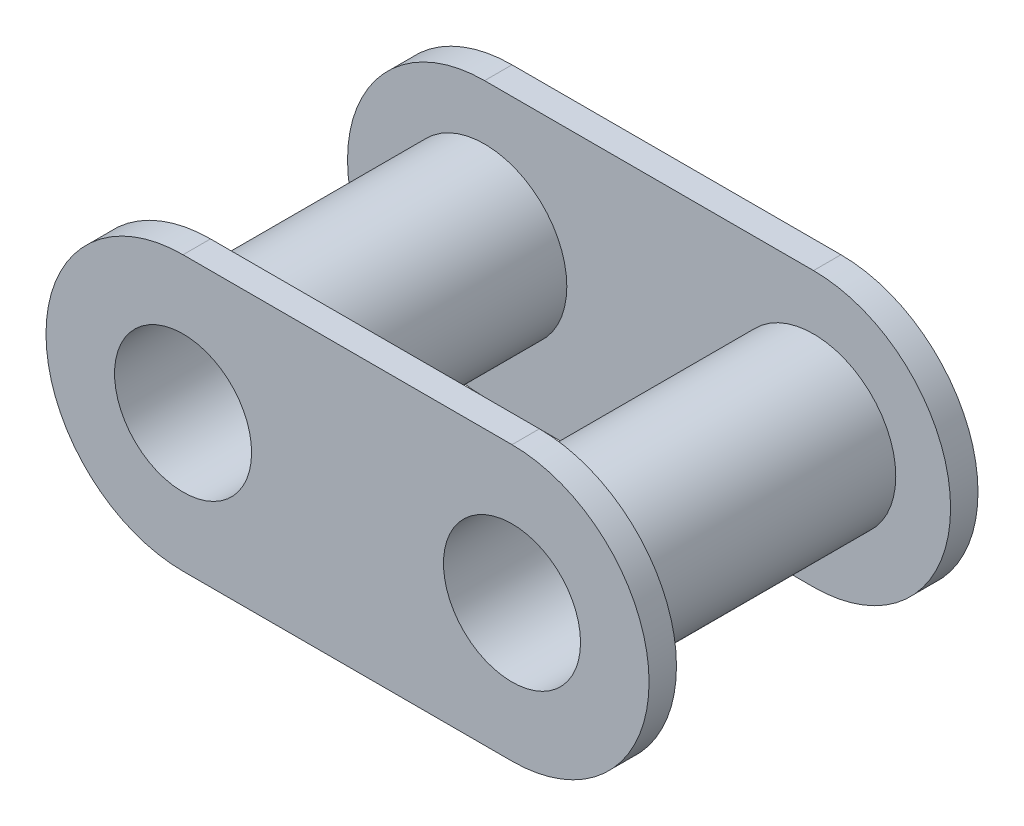
ISO-10303-21;
HEADER;
FILE_DESCRIPTION(('STEP AP214'),'2;1');
FILE_NAME('part.step','',(''),(''),'','','');
FILE_SCHEMA(('AUTOMOTIVE_DESIGN { 1 0 10303 214 1 1 1 1 }'));
ENDSEC;
DATA;
#1=APPLICATION_CONTEXT('core data for automotive mechanical design processes');
#2=APPLICATION_PROTOCOL_DEFINITION('international standard','automotive_design',2000,#1);
#3=PRODUCT_CONTEXT('',#1,'mechanical');
#4=PRODUCT('Part','Part','',(#3));
#5=PRODUCT_RELATED_PRODUCT_CATEGORY('part','',(#4));
#6=PRODUCT_DEFINITION_FORMATION('','',#4);
#7=PRODUCT_DEFINITION_CONTEXT('part definition',#1,'design');
#8=PRODUCT_DEFINITION('design','',#6,#7);
#9=PRODUCT_DEFINITION_SHAPE('','',#8);
#10=(LENGTH_UNIT() NAMED_UNIT(*) SI_UNIT(.MILLI.,.METRE.));
#11=(NAMED_UNIT(*) PLANE_ANGLE_UNIT() SI_UNIT($,.RADIAN.));
#12=(NAMED_UNIT(*) SI_UNIT($,.STERADIAN.) SOLID_ANGLE_UNIT());
#13=UNCERTAINTY_MEASURE_WITH_UNIT(LENGTH_MEASURE(1.E-05),#10,'distance_accuracy_value','');
#14=(GEOMETRIC_REPRESENTATION_CONTEXT(3) GLOBAL_UNCERTAINTY_ASSIGNED_CONTEXT((#13)) GLOBAL_UNIT_ASSIGNED_CONTEXT((#10,
#11,#12)) REPRESENTATION_CONTEXT('',''));
#15=CARTESIAN_POINT('',(0.,0.,0.));
#16=DIRECTION('',(0.,0.,1.));
#17=DIRECTION('',(1.,0.,0.));
#18=AXIS2_PLACEMENT_3D('',#15,#16,#17);
#19=CARTESIAN_POINT('',(-3.,0.,0.5));
#20=DIRECTION('',(0.,0.,1.));
#21=DIRECTION('',(1.,0.,0.));
#22=AXIS2_PLACEMENT_3D('',#19,#20,#21);
#23=PLANE('',#22);
#24=CARTESIAN_POINT('',(-3.,0.,0.5));
#25=DIRECTION('',(0.,0.,1.));
#26=DIRECTION('',(1.,0.,0.));
#27=AXIS2_PLACEMENT_3D('',#24,#25,#26);
#28=CIRCLE('',#27,1.5);
#29=CARTESIAN_POINT('',(-1.5,0.,0.5));
#30=VERTEX_POINT('',#29);
#31=EDGE_CURVE('E189',#30,#30,#28,.T.);
#32=ORIENTED_EDGE('',*,*,#31,.F.);
#33=EDGE_LOOP('',(#32));
#34=FACE_BOUND('',#33,.T.);
#35=CARTESIAN_POINT('',(-3.,0.,0.5));
#36=DIRECTION('',(0.,0.,1.));
#37=DIRECTION('',(1.,0.,0.));
#38=AXIS2_PLACEMENT_3D('',#35,#36,#37);
#39=CIRCLE('',#38,2.5);
#40=CARTESIAN_POINT('',(-3.,2.5,0.5));
#41=VERTEX_POINT('',#40);
#42=CARTESIAN_POINT('',(-3.,-2.5,0.5));
#43=VERTEX_POINT('',#42);
#44=EDGE_CURVE('E202',#41,#43,#39,.T.);
#45=ORIENTED_EDGE('',*,*,#44,.T.);
#46=DIRECTION('',(1.,0.,0.));
#47=VECTOR('',#46,1.);
#48=CARTESIAN_POINT('',(-3.,-2.5,0.5));
#49=LINE('',#48,#47);
#50=CARTESIAN_POINT('',(3.,-2.5,0.5));
#51=VERTEX_POINT('',#50);
#52=EDGE_CURVE('E100',#43,#51,#49,.T.);
#53=ORIENTED_EDGE('',*,*,#52,.T.);
#54=CARTESIAN_POINT('',(3.,0.,0.5));
#55=DIRECTION('',(0.,0.,1.));
#56=DIRECTION('',(1.,0.,0.));
#57=AXIS2_PLACEMENT_3D('',#54,#55,#56);
#58=CIRCLE('',#57,2.5);
#59=CARTESIAN_POINT('',(3.,2.5,0.5));
#60=VERTEX_POINT('',#59);
#61=EDGE_CURVE('E207',#51,#60,#58,.T.);
#62=ORIENTED_EDGE('',*,*,#61,.T.);
#63=DIRECTION('',(-1.,0.,0.));
#64=VECTOR('',#63,1.);
#65=CARTESIAN_POINT('',(-3.,2.5,0.5));
#66=LINE('',#65,#64);
#67=EDGE_CURVE('E69',#60,#41,#66,.T.);
#68=ORIENTED_EDGE('',*,*,#67,.T.);
#69=EDGE_LOOP('',(#45,#53,#62,#68));
#70=FACE_BOUND('',#69,.T.);
#71=CARTESIAN_POINT('',(3.,0.,0.5));
#72=DIRECTION('',(0.,0.,1.));
#73=DIRECTION('',(1.,0.,0.));
#74=AXIS2_PLACEMENT_3D('',#71,#72,#73);
#75=CIRCLE('',#74,1.5);
#76=CARTESIAN_POINT('',(4.5,0.,0.5));
#77=VERTEX_POINT('',#76);
#78=EDGE_CURVE('E139',#77,#77,#75,.T.);
#79=ORIENTED_EDGE('',*,*,#78,.F.);
#80=EDGE_LOOP('',(#79));
#81=FACE_BOUND('',#80,.T.);
#82=ADVANCED_FACE('F51',(#34,#70,#81),#23,.T.);
#83=CARTESIAN_POINT('',(-3.,0.,0.));
#84=DIRECTION('',(0.,0.,1.));
#85=DIRECTION('',(1.,0.,0.));
#86=AXIS2_PLACEMENT_3D('',#83,#84,#85);
#87=PLANE('',#86);
#88=CARTESIAN_POINT('',(-3.,0.,0.));
#89=DIRECTION('',(0.,0.,1.));
#90=DIRECTION('',(1.,0.,0.));
#91=AXIS2_PLACEMENT_3D('',#88,#89,#90);
#92=CIRCLE('',#91,2.5);
#93=CARTESIAN_POINT('',(-3.,2.5,0.));
#94=VERTEX_POINT('',#93);
#95=CARTESIAN_POINT('',(-3.,-2.5,0.));
#96=VERTEX_POINT('',#95);
#97=EDGE_CURVE('E201',#94,#96,#92,.T.);
#98=ORIENTED_EDGE('',*,*,#97,.F.);
#99=DIRECTION('',(-1.,0.,0.));
#100=VECTOR('',#99,1.);
#101=CARTESIAN_POINT('',(-3.,2.5,0.));
#102=LINE('',#101,#100);
#103=CARTESIAN_POINT('',(3.,2.5,0.));
#104=VERTEX_POINT('',#103);
#105=EDGE_CURVE('E93',#104,#94,#102,.T.);
#106=ORIENTED_EDGE('',*,*,#105,.F.);
#107=CARTESIAN_POINT('',(3.,0.,0.));
#108=DIRECTION('',(0.,0.,1.));
#109=DIRECTION('',(1.,0.,0.));
#110=AXIS2_PLACEMENT_3D('',#107,#108,#109);
#111=CIRCLE('',#110,2.5);
#112=CARTESIAN_POINT('',(3.,-2.5,0.));
#113=VERTEX_POINT('',#112);
#114=EDGE_CURVE('E87',#113,#104,#111,.T.);
#115=ORIENTED_EDGE('',*,*,#114,.F.);
#116=DIRECTION('',(1.,0.,0.));
#117=VECTOR('',#116,1.);
#118=CARTESIAN_POINT('',(-3.,-2.5,0.));
#119=LINE('',#118,#117);
#120=EDGE_CURVE('E216',#96,#113,#119,.T.);
#121=ORIENTED_EDGE('',*,*,#120,.F.);
#122=EDGE_LOOP('',(#98,#106,#115,#121));
#123=FACE_BOUND('',#122,.T.);
#124=CARTESIAN_POINT('',(-3.,0.,0.));
#125=DIRECTION('',(0.,0.,1.));
#126=DIRECTION('',(1.,0.,0.));
#127=AXIS2_PLACEMENT_3D('',#124,#125,#126);
#128=CIRCLE('',#127,1.25);
#129=CARTESIAN_POINT('',(-1.75,0.,0.));
#130=VERTEX_POINT('',#129);
#131=EDGE_CURVE('E197',#130,#130,#128,.T.);
#132=ORIENTED_EDGE('',*,*,#131,.T.);
#133=EDGE_LOOP('',(#132));
#134=FACE_BOUND('',#133,.T.);
#135=CARTESIAN_POINT('',(3.,0.,0.));
#136=DIRECTION('',(0.,0.,1.));
#137=DIRECTION('',(1.,0.,0.));
#138=AXIS2_PLACEMENT_3D('',#135,#136,#137);
#139=CIRCLE('',#138,1.25);
#140=CARTESIAN_POINT('',(4.25,0.,0.));
#141=VERTEX_POINT('',#140);
#142=EDGE_CURVE('E193',#141,#141,#139,.T.);
#143=ORIENTED_EDGE('',*,*,#142,.T.);
#144=EDGE_LOOP('',(#143));
#145=FACE_BOUND('',#144,.T.);
#146=ADVANCED_FACE('F232',(#123,#134,#145),#87,.F.);
#147=CARTESIAN_POINT('',(-3.,0.,0.5));
#148=DIRECTION('',(0.,0.,-1.));
#149=DIRECTION('',(-1.,0.,0.));
#150=AXIS2_PLACEMENT_3D('',#147,#148,#149);
#151=CYLINDRICAL_SURFACE('',#150,2.5);
#152=ORIENTED_EDGE('',*,*,#97,.T.);
#153=DIRECTION('',(0.,0.,-1.));
#154=VECTOR('',#153,1.);
#155=CARTESIAN_POINT('',(-3.,-2.5,0.5));
#156=LINE('',#155,#154);
#157=EDGE_CURVE('E12',#43,#96,#156,.T.);
#158=ORIENTED_EDGE('',*,*,#157,.F.);
#159=ORIENTED_EDGE('',*,*,#44,.F.);
#160=DIRECTION('',(0.,0.,-1.));
#161=VECTOR('',#160,1.);
#162=CARTESIAN_POINT('',(-3.,2.5,0.5));
#163=LINE('',#162,#161);
#164=EDGE_CURVE('E212',#41,#94,#163,.T.);
#165=ORIENTED_EDGE('',*,*,#164,.T.);
#166=EDGE_LOOP('',(#152,#158,#159,#165));
#167=FACE_BOUND('',#166,.T.);
#168=ADVANCED_FACE('F53',(#167),#151,.T.);
#169=CARTESIAN_POINT('',(-3.,-2.5,0.5));
#170=DIRECTION('',(0.,1.,0.));
#171=DIRECTION('',(-1.,0.,0.));
#172=AXIS2_PLACEMENT_3D('',#169,#170,#171);
#173=PLANE('',#172);
#174=ORIENTED_EDGE('',*,*,#120,.T.);
#175=DIRECTION('',(0.,0.,-1.));
#176=VECTOR('',#175,1.);
#177=CARTESIAN_POINT('',(3.,-2.5,0.5));
#178=LINE('',#177,#176);
#179=EDGE_CURVE('E61',#51,#113,#178,.T.);
#180=ORIENTED_EDGE('',*,*,#179,.F.);
#181=ORIENTED_EDGE('',*,*,#52,.F.);
#182=ORIENTED_EDGE('',*,*,#157,.T.);
#183=EDGE_LOOP('',(#174,#180,#181,#182));
#184=FACE_BOUND('',#183,.T.);
#185=ADVANCED_FACE('F248',(#184),#173,.F.);
#186=CARTESIAN_POINT('',(3.,0.,0.5));
#187=DIRECTION('',(0.,0.,-1.));
#188=DIRECTION('',(-1.,0.,0.));
#189=AXIS2_PLACEMENT_3D('',#186,#187,#188);
#190=CYLINDRICAL_SURFACE('',#189,2.5);
#191=ORIENTED_EDGE('',*,*,#114,.T.);
#192=DIRECTION('',(0.,0.,-1.));
#193=VECTOR('',#192,1.);
#194=CARTESIAN_POINT('',(3.,2.5,0.5));
#195=LINE('',#194,#193);
#196=EDGE_CURVE('E225',#60,#104,#195,.T.);
#197=ORIENTED_EDGE('',*,*,#196,.F.);
#198=ORIENTED_EDGE('',*,*,#61,.F.);
#199=ORIENTED_EDGE('',*,*,#179,.T.);
#200=EDGE_LOOP('',(#191,#197,#198,#199));
#201=FACE_BOUND('',#200,.T.);
#202=ADVANCED_FACE('F229',(#201),#190,.T.);
#203=CARTESIAN_POINT('',(-3.,2.5,0.5));
#204=DIRECTION('',(0.,-1.,0.));
#205=DIRECTION('',(1.,0.,0.));
#206=AXIS2_PLACEMENT_3D('',#203,#204,#205);
#207=PLANE('',#206);
#208=ORIENTED_EDGE('',*,*,#105,.T.);
#209=ORIENTED_EDGE('',*,*,#164,.F.);
#210=ORIENTED_EDGE('',*,*,#67,.F.);
#211=ORIENTED_EDGE('',*,*,#196,.T.);
#212=EDGE_LOOP('',(#208,#209,#210,#211));
#213=FACE_BOUND('',#212,.T.);
#214=ADVANCED_FACE('F237',(#213),#207,.F.);
#215=CARTESIAN_POINT('',(-3.,0.,0.5));
#216=DIRECTION('',(0.,0.,-1.));
#217=DIRECTION('',(-1.,0.,0.));
#218=AXIS2_PLACEMENT_3D('',#215,#216,#217);
#219=CYLINDRICAL_SURFACE('',#218,1.25);
#220=ORIENTED_EDGE('',*,*,#131,.F.);
#221=EDGE_LOOP('',(#220));
#222=FACE_BOUND('',#221,.T.);
#223=CARTESIAN_POINT('',(-3.,0.,6.));
#224=DIRECTION('',(0.,0.,1.));
#225=DIRECTION('',(1.,0.,0.));
#226=AXIS2_PLACEMENT_3D('',#223,#224,#225);
#227=CIRCLE('',#226,1.25);
#228=CARTESIAN_POINT('',(-1.75,0.,6.));
#229=VERTEX_POINT('',#228);
#230=EDGE_CURVE('E163',#229,#229,#227,.T.);
#231=ORIENTED_EDGE('',*,*,#230,.T.);
#232=EDGE_LOOP('',(#231));
#233=FACE_BOUND('',#232,.T.);
#234=ADVANCED_FACE('F239',(#222,#233),#219,.F.);
#235=CARTESIAN_POINT('',(3.,0.,0.5));
#236=DIRECTION('',(0.,0.,-1.));
#237=DIRECTION('',(-1.,0.,0.));
#238=AXIS2_PLACEMENT_3D('',#235,#236,#237);
#239=CYLINDRICAL_SURFACE('',#238,1.25);
#240=ORIENTED_EDGE('',*,*,#142,.F.);
#241=EDGE_LOOP('',(#240));
#242=FACE_BOUND('',#241,.T.);
#243=CARTESIAN_POINT('',(3.,0.,6.));
#244=DIRECTION('',(0.,0.,1.));
#245=DIRECTION('',(1.,0.,0.));
#246=AXIS2_PLACEMENT_3D('',#243,#244,#245);
#247=CIRCLE('',#246,1.25);
#248=CARTESIAN_POINT('',(4.25,0.,6.));
#249=VERTEX_POINT('',#248);
#250=EDGE_CURVE('E295',#249,#249,#247,.T.);
#251=ORIENTED_EDGE('',*,*,#250,.T.);
#252=EDGE_LOOP('',(#251));
#253=FACE_BOUND('',#252,.T.);
#254=ADVANCED_FACE('F245',(#242,#253),#239,.F.);
#255=CARTESIAN_POINT('',(-3.,0.,3.));
#256=DIRECTION('',(0.,0.,-1.));
#257=DIRECTION('',(-1.,0.,0.));
#258=AXIS2_PLACEMENT_3D('',#255,#256,#257);
#259=CYLINDRICAL_SURFACE('',#258,1.5);
#260=ORIENTED_EDGE('',*,*,#31,.T.);
#261=EDGE_LOOP('',(#260));
#262=FACE_BOUND('',#261,.T.);
#263=CARTESIAN_POINT('',(-3.,0.,5.5));
#264=DIRECTION('',(0.,0.,1.));
#265=DIRECTION('',(1.,0.,0.));
#266=AXIS2_PLACEMENT_3D('',#263,#264,#265);
#267=CIRCLE('',#266,1.5);
#268=CARTESIAN_POINT('',(-1.5,0.,5.5));
#269=VERTEX_POINT('',#268);
#270=EDGE_CURVE('E292',#269,#269,#267,.T.);
#271=ORIENTED_EDGE('',*,*,#270,.F.);
#272=EDGE_LOOP('',(#271));
#273=FACE_BOUND('',#272,.T.);
#274=ADVANCED_FACE('F261',(#262,#273),#259,.T.);
#275=CARTESIAN_POINT('',(3.,0.,3.));
#276=DIRECTION('',(0.,0.,-1.));
#277=DIRECTION('',(-1.,0.,0.));
#278=AXIS2_PLACEMENT_3D('',#275,#276,#277);
#279=CYLINDRICAL_SURFACE('',#278,1.5);
#280=ORIENTED_EDGE('',*,*,#78,.T.);
#281=EDGE_LOOP('',(#280));
#282=FACE_BOUND('',#281,.T.);
#283=CARTESIAN_POINT('',(3.,0.,5.5));
#284=DIRECTION('',(0.,0.,1.));
#285=DIRECTION('',(1.,0.,0.));
#286=AXIS2_PLACEMENT_3D('',#283,#284,#285);
#287=CIRCLE('',#286,1.5);
#288=CARTESIAN_POINT('',(4.5,0.,5.5));
#289=VERTEX_POINT('',#288);
#290=EDGE_CURVE('E296',#289,#289,#287,.T.);
#291=ORIENTED_EDGE('',*,*,#290,.F.);
#292=EDGE_LOOP('',(#291));
#293=FACE_BOUND('',#292,.T.);
#294=ADVANCED_FACE('F265',(#282,#293),#279,.T.);
#295=CARTESIAN_POINT('',(-3.,0.,5.5));
#296=DIRECTION('',(0.,0.,-1.));
#297=DIRECTION('',(1.,0.,0.));
#298=AXIS2_PLACEMENT_3D('',#295,#296,#297);
#299=PLANE('',#298);
#300=ORIENTED_EDGE('',*,*,#270,.T.);
#301=EDGE_LOOP('',(#300));
#302=FACE_BOUND('',#301,.T.);
#303=CARTESIAN_POINT('',(-3.,0.,5.5));
#304=DIRECTION('',(0.,0.,1.));
#305=DIRECTION('',(1.,0.,0.));
#306=AXIS2_PLACEMENT_3D('',#303,#304,#305);
#307=CIRCLE('',#306,2.5);
#308=CARTESIAN_POINT('',(-3.,2.5,5.5));
#309=VERTEX_POINT('',#308);
#310=CARTESIAN_POINT('',(-3.,-2.5,5.5));
#311=VERTEX_POINT('',#310);
#312=EDGE_CURVE('E147',#309,#311,#307,.T.);
#313=ORIENTED_EDGE('',*,*,#312,.F.);
#314=DIRECTION('',(-1.,0.,0.));
#315=VECTOR('',#314,1.);
#316=CARTESIAN_POINT('',(-3.,2.5,5.5));
#317=LINE('',#316,#315);
#318=CARTESIAN_POINT('',(3.,2.5,5.5));
#319=VERTEX_POINT('',#318);
#320=EDGE_CURVE('E168',#319,#309,#317,.T.);
#321=ORIENTED_EDGE('',*,*,#320,.F.);
#322=CARTESIAN_POINT('',(3.,0.,5.5));
#323=DIRECTION('',(0.,0.,1.));
#324=DIRECTION('',(1.,0.,0.));
#325=AXIS2_PLACEMENT_3D('',#322,#323,#324);
#326=CIRCLE('',#325,2.5);
#327=CARTESIAN_POINT('',(3.,-2.5,5.5));
#328=VERTEX_POINT('',#327);
#329=EDGE_CURVE('E149',#328,#319,#326,.T.);
#330=ORIENTED_EDGE('',*,*,#329,.F.);
#331=DIRECTION('',(1.,0.,0.));
#332=VECTOR('',#331,1.);
#333=CARTESIAN_POINT('',(-3.,-2.5,5.5));
#334=LINE('',#333,#332);
#335=EDGE_CURVE('E130',#311,#328,#334,.T.);
#336=ORIENTED_EDGE('',*,*,#335,.F.);
#337=EDGE_LOOP('',(#313,#321,#330,#336));
#338=FACE_BOUND('',#337,.T.);
#339=ORIENTED_EDGE('',*,*,#290,.T.);
#340=EDGE_LOOP('',(#339));
#341=FACE_BOUND('',#340,.T.);
#342=ADVANCED_FACE('F144',(#302,#338,#341),#299,.T.);
#343=CARTESIAN_POINT('',(-3.,0.,6.));
#344=DIRECTION('',(0.,0.,-1.));
#345=DIRECTION('',(1.,0.,0.));
#346=AXIS2_PLACEMENT_3D('',#343,#344,#345);
#347=PLANE('',#346);
#348=CARTESIAN_POINT('',(-3.,0.,6.));
#349=DIRECTION('',(0.,0.,1.));
#350=DIRECTION('',(1.,0.,0.));
#351=AXIS2_PLACEMENT_3D('',#348,#349,#350);
#352=CIRCLE('',#351,2.5);
#353=CARTESIAN_POINT('',(-3.,2.5,6.));
#354=VERTEX_POINT('',#353);
#355=CARTESIAN_POINT('',(-3.,-2.5,6.));
#356=VERTEX_POINT('',#355);
#357=EDGE_CURVE('E171',#354,#356,#352,.T.);
#358=ORIENTED_EDGE('',*,*,#357,.T.);
#359=DIRECTION('',(1.,0.,0.));
#360=VECTOR('',#359,1.);
#361=CARTESIAN_POINT('',(-3.,-2.5,6.));
#362=LINE('',#361,#360);
#363=CARTESIAN_POINT('',(3.,-2.5,6.));
#364=VERTEX_POINT('',#363);
#365=EDGE_CURVE('E133',#356,#364,#362,.T.);
#366=ORIENTED_EDGE('',*,*,#365,.T.);
#367=CARTESIAN_POINT('',(3.,0.,6.));
#368=DIRECTION('',(0.,0.,1.));
#369=DIRECTION('',(1.,0.,0.));
#370=AXIS2_PLACEMENT_3D('',#367,#368,#369);
#371=CIRCLE('',#370,2.5);
#372=CARTESIAN_POINT('',(3.,2.5,6.));
#373=VERTEX_POINT('',#372);
#374=EDGE_CURVE('E160',#364,#373,#371,.T.);
#375=ORIENTED_EDGE('',*,*,#374,.T.);
#376=DIRECTION('',(-1.,0.,0.));
#377=VECTOR('',#376,1.);
#378=CARTESIAN_POINT('',(-3.,2.5,6.));
#379=LINE('',#378,#377);
#380=EDGE_CURVE('E156',#373,#354,#379,.T.);
#381=ORIENTED_EDGE('',*,*,#380,.T.);
#382=EDGE_LOOP('',(#358,#366,#375,#381));
#383=FACE_BOUND('',#382,.T.);
#384=ORIENTED_EDGE('',*,*,#230,.F.);
#385=EDGE_LOOP('',(#384));
#386=FACE_BOUND('',#385,.T.);
#387=ORIENTED_EDGE('',*,*,#250,.F.);
#388=EDGE_LOOP('',(#387));
#389=FACE_BOUND('',#388,.T.);
#390=ADVANCED_FACE('F272',(#383,#386,#389),#347,.F.);
#391=CARTESIAN_POINT('',(-3.,0.,5.5));
#392=DIRECTION('',(0.,0.,1.));
#393=DIRECTION('',(-1.,0.,0.));
#394=AXIS2_PLACEMENT_3D('',#391,#392,#393);
#395=CYLINDRICAL_SURFACE('',#394,2.5);
#396=ORIENTED_EDGE('',*,*,#357,.F.);
#397=DIRECTION('',(0.,0.,1.));
#398=VECTOR('',#397,1.);
#399=CARTESIAN_POINT('',(-3.,2.5,5.5));
#400=LINE('',#399,#398);
#401=EDGE_CURVE('E153',#309,#354,#400,.T.);
#402=ORIENTED_EDGE('',*,*,#401,.F.);
#403=ORIENTED_EDGE('',*,*,#312,.T.);
#404=DIRECTION('',(0.,0.,1.));
#405=VECTOR('',#404,1.);
#406=CARTESIAN_POINT('',(-3.,-2.5,5.5));
#407=LINE('',#406,#405);
#408=EDGE_CURVE('E127',#311,#356,#407,.T.);
#409=ORIENTED_EDGE('',*,*,#408,.T.);
#410=EDGE_LOOP('',(#396,#402,#403,#409));
#411=FACE_BOUND('',#410,.T.);
#412=ADVANCED_FACE('F152',(#411),#395,.T.);
#413=CARTESIAN_POINT('',(-3.,-2.5,5.5));
#414=DIRECTION('',(0.,1.,0.));
#415=DIRECTION('',(-1.,0.,0.));
#416=AXIS2_PLACEMENT_3D('',#413,#414,#415);
#417=PLANE('',#416);
#418=ORIENTED_EDGE('',*,*,#365,.F.);
#419=ORIENTED_EDGE('',*,*,#408,.F.);
#420=ORIENTED_EDGE('',*,*,#335,.T.);
#421=DIRECTION('',(0.,0.,1.));
#422=VECTOR('',#421,1.);
#423=CARTESIAN_POINT('',(3.,-2.5,5.5));
#424=LINE('',#423,#422);
#425=EDGE_CURVE('E140',#328,#364,#424,.T.);
#426=ORIENTED_EDGE('',*,*,#425,.T.);
#427=EDGE_LOOP('',(#418,#419,#420,#426));
#428=FACE_BOUND('',#427,.T.);
#429=ADVANCED_FACE('F129',(#428),#417,.F.);
#430=CARTESIAN_POINT('',(3.,0.,5.5));
#431=DIRECTION('',(0.,0.,1.));
#432=DIRECTION('',(-1.,0.,0.));
#433=AXIS2_PLACEMENT_3D('',#430,#431,#432);
#434=CYLINDRICAL_SURFACE('',#433,2.5);
#435=ORIENTED_EDGE('',*,*,#374,.F.);
#436=ORIENTED_EDGE('',*,*,#425,.F.);
#437=ORIENTED_EDGE('',*,*,#329,.T.);
#438=DIRECTION('',(0.,0.,1.));
#439=VECTOR('',#438,1.);
#440=CARTESIAN_POINT('',(3.,2.5,5.5));
#441=LINE('',#440,#439);
#442=EDGE_CURVE('E181',#319,#373,#441,.T.);
#443=ORIENTED_EDGE('',*,*,#442,.T.);
#444=EDGE_LOOP('',(#435,#436,#437,#443));
#445=FACE_BOUND('',#444,.T.);
#446=ADVANCED_FACE('F275',(#445),#434,.T.);
#447=CARTESIAN_POINT('',(-3.,2.5,5.5));
#448=DIRECTION('',(0.,-1.,0.));
#449=DIRECTION('',(1.,0.,0.));
#450=AXIS2_PLACEMENT_3D('',#447,#448,#449);
#451=PLANE('',#450);
#452=ORIENTED_EDGE('',*,*,#380,.F.);
#453=ORIENTED_EDGE('',*,*,#442,.F.);
#454=ORIENTED_EDGE('',*,*,#320,.T.);
#455=ORIENTED_EDGE('',*,*,#401,.T.);
#456=EDGE_LOOP('',(#452,#453,#454,#455));
#457=FACE_BOUND('',#456,.T.);
#458=ADVANCED_FACE('F278',(#457),#451,.F.);
#459=CLOSED_SHELL('',(#82,#146,#168,#185,#202,#214,#234,#254,#274,#294,#342,#390,#412,#429,#446,#458));
#460=MANIFOLD_SOLID_BREP('B2',#459);
#461=ADVANCED_BREP_SHAPE_REPRESENTATION('',(#18,#460),#14);
#462=SHAPE_DEFINITION_REPRESENTATION(#9,#461);
ENDSEC;
END-ISO-10303-21;
